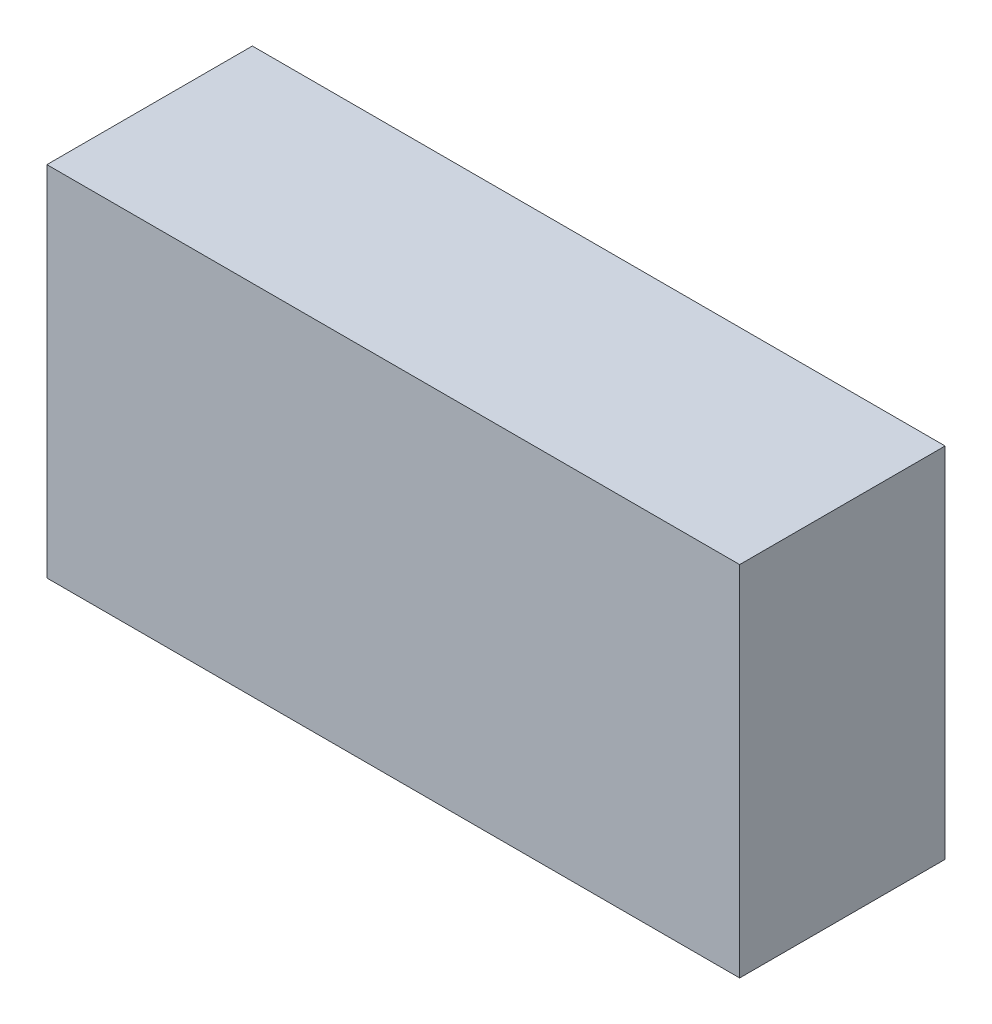
ISO-10303-21;
HEADER;
FILE_DESCRIPTION(('STEP AP214'),'2;1');
FILE_NAME('part.step','',(''),(''),'','','');
FILE_SCHEMA(('AUTOMOTIVE_DESIGN { 1 0 10303 214 1 1 1 1 }'));
ENDSEC;
DATA;
#1=APPLICATION_CONTEXT('core data for automotive mechanical design processes');
#2=APPLICATION_PROTOCOL_DEFINITION('international standard','automotive_design',2000,#1);
#3=PRODUCT_CONTEXT('',#1,'mechanical');
#4=PRODUCT('Part','Part','',(#3));
#5=PRODUCT_RELATED_PRODUCT_CATEGORY('part','',(#4));
#6=PRODUCT_DEFINITION_FORMATION('','',#4);
#7=PRODUCT_DEFINITION_CONTEXT('part definition',#1,'design');
#8=PRODUCT_DEFINITION('design','',#6,#7);
#9=PRODUCT_DEFINITION_SHAPE('','',#8);
#10=(LENGTH_UNIT() NAMED_UNIT(*) SI_UNIT(.MILLI.,.METRE.));
#11=(NAMED_UNIT(*) PLANE_ANGLE_UNIT() SI_UNIT($,.RADIAN.));
#12=(NAMED_UNIT(*) SI_UNIT($,.STERADIAN.) SOLID_ANGLE_UNIT());
#13=UNCERTAINTY_MEASURE_WITH_UNIT(LENGTH_MEASURE(1.E-05),#10,'distance_accuracy_value','');
#14=(GEOMETRIC_REPRESENTATION_CONTEXT(3) GLOBAL_UNCERTAINTY_ASSIGNED_CONTEXT((#13)) GLOBAL_UNIT_ASSIGNED_CONTEXT((#10,
#11,#12)) REPRESENTATION_CONTEXT('',''));
#15=CARTESIAN_POINT('',(0.,0.,0.));
#16=DIRECTION('',(0.,0.,1.));
#17=DIRECTION('',(1.,0.,0.));
#18=AXIS2_PLACEMENT_3D('',#15,#16,#17);
#19=CARTESIAN_POINT('',(28.83,-14.9,17.1));
#20=DIRECTION('',(-1.,0.,0.));
#21=DIRECTION('',(0.,0.,1.));
#22=AXIS2_PLACEMENT_3D('',#19,#20,#21);
#23=PLANE('',#22);
#24=DIRECTION('',(0.,1.,0.));
#25=VECTOR('',#24,1.);
#26=CARTESIAN_POINT('',(28.83,-14.9,0.));
#27=LINE('',#26,#25);
#28=CARTESIAN_POINT('',(28.83,-14.9,0.));
#29=VERTEX_POINT('',#28);
#30=CARTESIAN_POINT('',(28.83,14.9,0.));
#31=VERTEX_POINT('',#30);
#32=EDGE_CURVE('E102',#29,#31,#27,.T.);
#33=ORIENTED_EDGE('',*,*,#32,.T.);
#34=DIRECTION('',(0.,0.,-1.));
#35=VECTOR('',#34,1.);
#36=CARTESIAN_POINT('',(28.83,14.9,17.1));
#37=LINE('',#36,#35);
#38=CARTESIAN_POINT('',(28.83,14.9,17.1));
#39=VERTEX_POINT('',#38);
#40=EDGE_CURVE('E11',#39,#31,#37,.T.);
#41=ORIENTED_EDGE('',*,*,#40,.F.);
#42=DIRECTION('',(0.,1.,0.));
#43=VECTOR('',#42,1.);
#44=CARTESIAN_POINT('',(28.83,-14.9,17.1));
#45=LINE('',#44,#43);
#46=CARTESIAN_POINT('',(28.83,-14.9,17.1));
#47=VERTEX_POINT('',#46);
#48=EDGE_CURVE('E90',#47,#39,#45,.T.);
#49=ORIENTED_EDGE('',*,*,#48,.F.);
#50=DIRECTION('',(0.,0.,-1.));
#51=VECTOR('',#50,1.);
#52=CARTESIAN_POINT('',(28.83,-14.9,17.1));
#53=LINE('',#52,#51);
#54=EDGE_CURVE('E98',#47,#29,#53,.T.);
#55=ORIENTED_EDGE('',*,*,#54,.T.);
#56=EDGE_LOOP('',(#33,#41,#49,#55));
#57=FACE_BOUND('',#56,.T.);
#58=ADVANCED_FACE('F39',(#57),#23,.F.);
#59=CARTESIAN_POINT('',(-28.83,14.9,17.1));
#60=DIRECTION('',(0.,-1.,0.));
#61=DIRECTION('',(0.,0.,-1.));
#62=AXIS2_PLACEMENT_3D('',#59,#60,#61);
#63=PLANE('',#62);
#64=DIRECTION('',(-1.,0.,0.));
#65=VECTOR('',#64,1.);
#66=CARTESIAN_POINT('',(-28.83,14.9,0.));
#67=LINE('',#66,#65);
#68=CARTESIAN_POINT('',(-28.83,14.9,0.));
#69=VERTEX_POINT('',#68);
#70=EDGE_CURVE('E94',#31,#69,#67,.T.);
#71=ORIENTED_EDGE('',*,*,#70,.T.);
#72=DIRECTION('',(0.,0.,-1.));
#73=VECTOR('',#72,1.);
#74=CARTESIAN_POINT('',(-28.83,14.9,17.1));
#75=LINE('',#74,#73);
#76=CARTESIAN_POINT('',(-28.83,14.9,17.1));
#77=VERTEX_POINT('',#76);
#78=EDGE_CURVE('E47',#77,#69,#75,.T.);
#79=ORIENTED_EDGE('',*,*,#78,.F.);
#80=DIRECTION('',(-1.,0.,0.));
#81=VECTOR('',#80,1.);
#82=CARTESIAN_POINT('',(-28.83,14.9,17.1));
#83=LINE('',#82,#81);
#84=EDGE_CURVE('E85',#39,#77,#83,.T.);
#85=ORIENTED_EDGE('',*,*,#84,.F.);
#86=ORIENTED_EDGE('',*,*,#40,.T.);
#87=EDGE_LOOP('',(#71,#79,#85,#86));
#88=FACE_BOUND('',#87,.T.);
#89=ADVANCED_FACE('F93',(#88),#63,.F.);
#90=CARTESIAN_POINT('',(-28.83,-14.9,17.1));
#91=DIRECTION('',(1.,0.,0.));
#92=DIRECTION('',(0.,0.,-1.));
#93=AXIS2_PLACEMENT_3D('',#90,#91,#92);
#94=PLANE('',#93);
#95=DIRECTION('',(0.,-1.,0.));
#96=VECTOR('',#95,1.);
#97=CARTESIAN_POINT('',(-28.83,-14.9,0.));
#98=LINE('',#97,#96);
#99=CARTESIAN_POINT('',(-28.83,-14.9,0.));
#100=VERTEX_POINT('',#99);
#101=EDGE_CURVE('E72',#69,#100,#98,.T.);
#102=ORIENTED_EDGE('',*,*,#101,.T.);
#103=DIRECTION('',(0.,0.,-1.));
#104=VECTOR('',#103,1.);
#105=CARTESIAN_POINT('',(-28.83,-14.9,17.1));
#106=LINE('',#105,#104);
#107=CARTESIAN_POINT('',(-28.83,-14.9,17.1));
#108=VERTEX_POINT('',#107);
#109=EDGE_CURVE('E95',#108,#100,#106,.T.);
#110=ORIENTED_EDGE('',*,*,#109,.F.);
#111=DIRECTION('',(0.,-1.,0.));
#112=VECTOR('',#111,1.);
#113=CARTESIAN_POINT('',(-28.83,-14.9,17.1));
#114=LINE('',#113,#112);
#115=EDGE_CURVE('E88',#77,#108,#114,.T.);
#116=ORIENTED_EDGE('',*,*,#115,.F.);
#117=ORIENTED_EDGE('',*,*,#78,.T.);
#118=EDGE_LOOP('',(#102,#110,#116,#117));
#119=FACE_BOUND('',#118,.T.);
#120=ADVANCED_FACE('F96',(#119),#94,.F.);
#121=CARTESIAN_POINT('',(-28.83,-14.9,17.1));
#122=DIRECTION('',(0.,1.,0.));
#123=DIRECTION('',(0.,0.,1.));
#124=AXIS2_PLACEMENT_3D('',#121,#122,#123);
#125=PLANE('',#124);
#126=DIRECTION('',(1.,0.,0.));
#127=VECTOR('',#126,1.);
#128=CARTESIAN_POINT('',(-28.83,-14.9,0.));
#129=LINE('',#128,#127);
#130=EDGE_CURVE('E78',#100,#29,#129,.T.);
#131=ORIENTED_EDGE('',*,*,#130,.T.);
#132=ORIENTED_EDGE('',*,*,#54,.F.);
#133=DIRECTION('',(1.,0.,0.));
#134=VECTOR('',#133,1.);
#135=CARTESIAN_POINT('',(-28.83,-14.9,17.1));
#136=LINE('',#135,#134);
#137=EDGE_CURVE('E55',#108,#47,#136,.T.);
#138=ORIENTED_EDGE('',*,*,#137,.F.);
#139=ORIENTED_EDGE('',*,*,#109,.T.);
#140=EDGE_LOOP('',(#131,#132,#138,#139));
#141=FACE_BOUND('',#140,.T.);
#142=ADVANCED_FACE('F109',(#141),#125,.F.);
#143=CARTESIAN_POINT('',(0.,0.,17.1));
#144=DIRECTION('',(0.,0.,-1.));
#145=DIRECTION('',(-1.,0.,0.));
#146=AXIS2_PLACEMENT_3D('',#143,#144,#145);
#147=PLANE('',#146);
#148=ORIENTED_EDGE('',*,*,#48,.T.);
#149=ORIENTED_EDGE('',*,*,#84,.T.);
#150=ORIENTED_EDGE('',*,*,#115,.T.);
#151=ORIENTED_EDGE('',*,*,#137,.T.);
#152=EDGE_LOOP('',(#148,#149,#150,#151));
#153=FACE_BOUND('',#152,.T.);
#154=ADVANCED_FACE('F86',(#153),#147,.F.);
#155=CARTESIAN_POINT('',(0.,0.,0.));
#156=DIRECTION('',(0.,0.,-1.));
#157=DIRECTION('',(-1.,0.,0.));
#158=AXIS2_PLACEMENT_3D('',#155,#156,#157);
#159=PLANE('',#158);
#160=ORIENTED_EDGE('',*,*,#32,.F.);
#161=ORIENTED_EDGE('',*,*,#130,.F.);
#162=ORIENTED_EDGE('',*,*,#101,.F.);
#163=ORIENTED_EDGE('',*,*,#70,.F.);
#164=EDGE_LOOP('',(#160,#161,#162,#163));
#165=FACE_BOUND('',#164,.T.);
#166=ADVANCED_FACE('F112',(#165),#159,.T.);
#167=CLOSED_SHELL('',(#58,#89,#120,#142,#154,#166));
#168=MANIFOLD_SOLID_BREP('B2',#167);
#169=ADVANCED_BREP_SHAPE_REPRESENTATION('',(#18,#168),#14);
#170=SHAPE_DEFINITION_REPRESENTATION(#9,#169);
ENDSEC;
END-ISO-10303-21;
